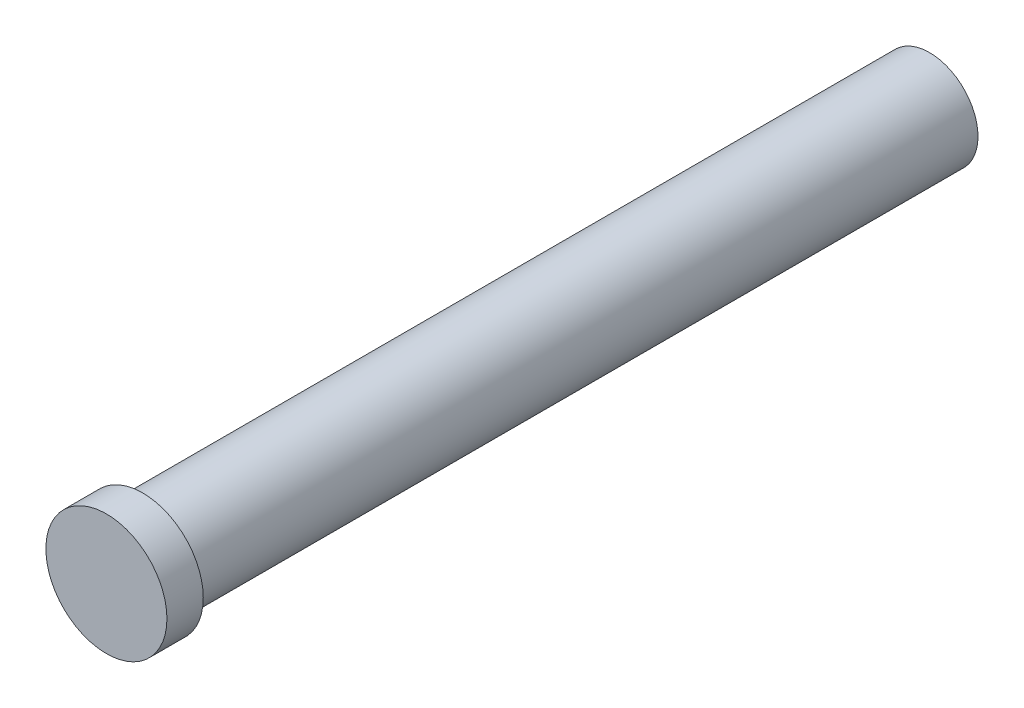
ISO-10303-21;
HEADER;
FILE_DESCRIPTION(('STEP AP214'),'2;1');
FILE_NAME('part.step','',(''),(''),'','','');
FILE_SCHEMA(('AUTOMOTIVE_DESIGN { 1 0 10303 214 1 1 1 1 }'));
ENDSEC;
DATA;
#1=APPLICATION_CONTEXT('core data for automotive mechanical design processes');
#2=APPLICATION_PROTOCOL_DEFINITION('international standard','automotive_design',2000,#1);
#3=PRODUCT_CONTEXT('',#1,'mechanical');
#4=PRODUCT('Part','Part','',(#3));
#5=PRODUCT_RELATED_PRODUCT_CATEGORY('part','',(#4));
#6=PRODUCT_DEFINITION_FORMATION('','',#4);
#7=PRODUCT_DEFINITION_CONTEXT('part definition',#1,'design');
#8=PRODUCT_DEFINITION('design','',#6,#7);
#9=PRODUCT_DEFINITION_SHAPE('','',#8);
#10=(LENGTH_UNIT() NAMED_UNIT(*) SI_UNIT(.MILLI.,.METRE.));
#11=(NAMED_UNIT(*) PLANE_ANGLE_UNIT() SI_UNIT($,.RADIAN.));
#12=(NAMED_UNIT(*) SI_UNIT($,.STERADIAN.) SOLID_ANGLE_UNIT());
#13=UNCERTAINTY_MEASURE_WITH_UNIT(LENGTH_MEASURE(1.E-05),#10,'distance_accuracy_value','');
#14=(GEOMETRIC_REPRESENTATION_CONTEXT(3) GLOBAL_UNCERTAINTY_ASSIGNED_CONTEXT((#13)) GLOBAL_UNIT_ASSIGNED_CONTEXT((#10,
#11,#12)) REPRESENTATION_CONTEXT('',''));
#15=CARTESIAN_POINT('',(0.,0.,0.));
#16=DIRECTION('',(0.,0.,1.));
#17=DIRECTION('',(1.,0.,0.));
#18=AXIS2_PLACEMENT_3D('',#15,#16,#17);
#19=CARTESIAN_POINT('',(0.,0.,65.));
#20=DIRECTION('',(0.,0.,-1.));
#21=DIRECTION('',(-1.,0.,0.));
#22=AXIS2_PLACEMENT_3D('',#19,#20,#21);
#23=CYLINDRICAL_SURFACE('',#22,4.);
#24=CARTESIAN_POINT('',(0.,0.,65.));
#25=DIRECTION('',(0.,0.,1.));
#26=DIRECTION('',(1.,0.,0.));
#27=AXIS2_PLACEMENT_3D('',#24,#25,#26);
#28=CIRCLE('',#27,4.);
#29=CARTESIAN_POINT('',(4.,0.,65.));
#30=VERTEX_POINT('',#29);
#31=EDGE_CURVE('E10',#30,#30,#28,.T.);
#32=ORIENTED_EDGE('',*,*,#31,.F.);
#33=EDGE_LOOP('',(#32));
#34=FACE_BOUND('',#33,.T.);
#35=CARTESIAN_POINT('',(0.,0.,0.));
#36=DIRECTION('',(0.,0.,1.));
#37=DIRECTION('',(1.,0.,0.));
#38=AXIS2_PLACEMENT_3D('',#35,#36,#37);
#39=CIRCLE('',#38,4.);
#40=CARTESIAN_POINT('',(4.,0.,0.));
#41=VERTEX_POINT('',#40);
#42=EDGE_CURVE('E40',#41,#41,#39,.T.);
#43=ORIENTED_EDGE('',*,*,#42,.T.);
#44=EDGE_LOOP('',(#43));
#45=FACE_BOUND('',#44,.T.);
#46=ADVANCED_FACE('F37',(#34,#45),#23,.T.);
#47=CARTESIAN_POINT('',(0.,0.,0.));
#48=DIRECTION('',(0.,0.,1.));
#49=DIRECTION('',(1.,0.,0.));
#50=AXIS2_PLACEMENT_3D('',#47,#48,#49);
#51=PLANE('',#50);
#52=ORIENTED_EDGE('',*,*,#42,.F.);
#53=EDGE_LOOP('',(#52));
#54=FACE_BOUND('',#53,.T.);
#55=ADVANCED_FACE('F64',(#54),#51,.F.);
#56=CARTESIAN_POINT('',(0.,0.,68.));
#57=DIRECTION('',(0.,0.,-1.));
#58=DIRECTION('',(-1.,0.,0.));
#59=AXIS2_PLACEMENT_3D('',#56,#57,#58);
#60=CYLINDRICAL_SURFACE('',#59,5.);
#61=CARTESIAN_POINT('',(0.,0.,68.));
#62=DIRECTION('',(0.,0.,1.));
#63=DIRECTION('',(1.,0.,0.));
#64=AXIS2_PLACEMENT_3D('',#61,#62,#63);
#65=CIRCLE('',#64,5.);
#66=CARTESIAN_POINT('',(5.,0.,68.));
#67=VERTEX_POINT('',#66);
#68=EDGE_CURVE('E49',#67,#67,#65,.T.);
#69=ORIENTED_EDGE('',*,*,#68,.F.);
#70=EDGE_LOOP('',(#69));
#71=FACE_BOUND('',#70,.T.);
#72=CARTESIAN_POINT('',(0.,0.,65.));
#73=DIRECTION('',(0.,0.,1.));
#74=DIRECTION('',(1.,0.,0.));
#75=AXIS2_PLACEMENT_3D('',#72,#73,#74);
#76=CIRCLE('',#75,5.);
#77=CARTESIAN_POINT('',(5.,0.,65.));
#78=VERTEX_POINT('',#77);
#79=EDGE_CURVE('E51',#78,#78,#76,.T.);
#80=ORIENTED_EDGE('',*,*,#79,.T.);
#81=EDGE_LOOP('',(#80));
#82=FACE_BOUND('',#81,.T.);
#83=ADVANCED_FACE('F61',(#71,#82),#60,.T.);
#84=CARTESIAN_POINT('',(0.,0.,68.));
#85=DIRECTION('',(0.,0.,1.));
#86=DIRECTION('',(1.,0.,0.));
#87=AXIS2_PLACEMENT_3D('',#84,#85,#86);
#88=PLANE('',#87);
#89=ORIENTED_EDGE('',*,*,#68,.T.);
#90=EDGE_LOOP('',(#89));
#91=FACE_BOUND('',#90,.T.);
#92=ADVANCED_FACE('F59',(#91),#88,.T.);
#93=CARTESIAN_POINT('',(0.,0.,65.));
#94=DIRECTION('',(0.,0.,1.));
#95=DIRECTION('',(1.,0.,0.));
#96=AXIS2_PLACEMENT_3D('',#93,#94,#95);
#97=PLANE('',#96);
#98=ORIENTED_EDGE('',*,*,#31,.T.);
#99=EDGE_LOOP('',(#98));
#100=FACE_BOUND('',#99,.T.);
#101=ORIENTED_EDGE('',*,*,#79,.F.);
#102=EDGE_LOOP('',(#101));
#103=FACE_BOUND('',#102,.T.);
#104=ADVANCED_FACE('F68',(#100,#103),#97,.F.);
#105=CLOSED_SHELL('',(#46,#55,#83,#92,#104));
#106=MANIFOLD_SOLID_BREP('B2',#105);
#107=ADVANCED_BREP_SHAPE_REPRESENTATION('',(#18,#106),#14);
#108=SHAPE_DEFINITION_REPRESENTATION(#9,#107);
ENDSEC;
END-ISO-10303-21;
